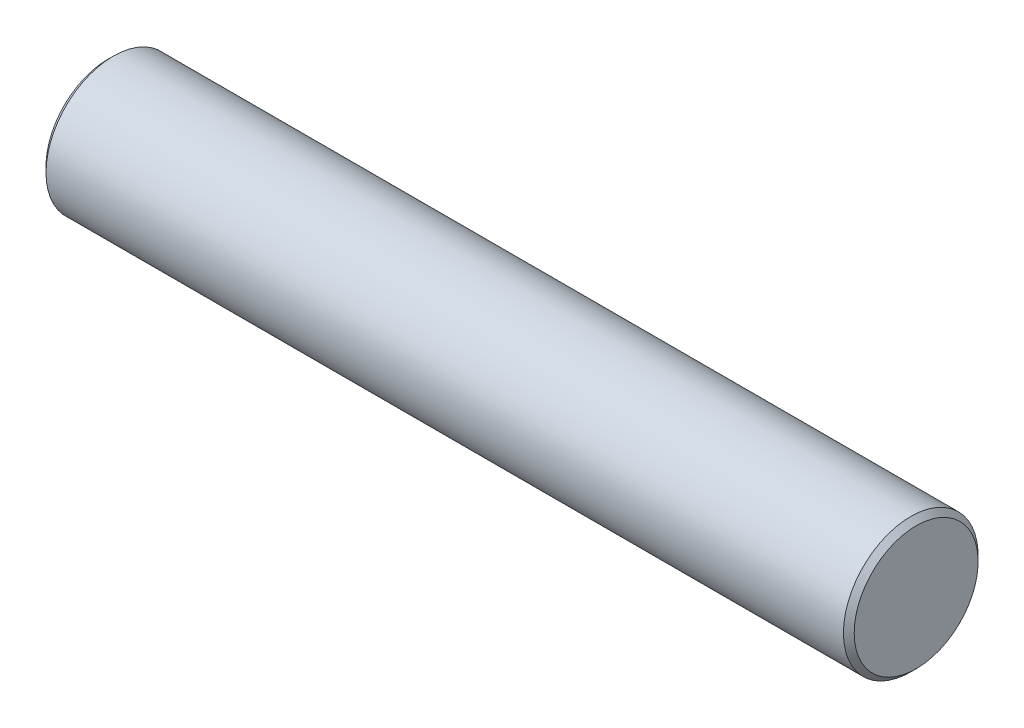
ISO-10303-21;
HEADER;
FILE_DESCRIPTION(('STEP AP214'),'2;1');
FILE_NAME('part.step','',(''),(''),'','','');
FILE_SCHEMA(('AUTOMOTIVE_DESIGN { 1 0 10303 214 1 1 1 1 }'));
ENDSEC;
DATA;
#1=APPLICATION_CONTEXT('core data for automotive mechanical design processes');
#2=APPLICATION_PROTOCOL_DEFINITION('international standard','automotive_design',2000,#1);
#3=PRODUCT_CONTEXT('',#1,'mechanical');
#4=PRODUCT('Part','Part','',(#3));
#5=PRODUCT_RELATED_PRODUCT_CATEGORY('part','',(#4));
#6=PRODUCT_DEFINITION_FORMATION('','',#4);
#7=PRODUCT_DEFINITION_CONTEXT('part definition',#1,'design');
#8=PRODUCT_DEFINITION('design','',#6,#7);
#9=PRODUCT_DEFINITION_SHAPE('','',#8);
#10=(LENGTH_UNIT() NAMED_UNIT(*) SI_UNIT(.MILLI.,.METRE.));
#11=(NAMED_UNIT(*) PLANE_ANGLE_UNIT() SI_UNIT($,.RADIAN.));
#12=(NAMED_UNIT(*) SI_UNIT($,.STERADIAN.) SOLID_ANGLE_UNIT());
#13=UNCERTAINTY_MEASURE_WITH_UNIT(LENGTH_MEASURE(1.E-05),#10,'distance_accuracy_value','');
#14=(GEOMETRIC_REPRESENTATION_CONTEXT(3) GLOBAL_UNCERTAINTY_ASSIGNED_CONTEXT((#13)) GLOBAL_UNIT_ASSIGNED_CONTEXT((#10,
#11,#12)) REPRESENTATION_CONTEXT('',''));
#15=CARTESIAN_POINT('',(0.,0.,0.));
#16=DIRECTION('',(0.,0.,1.));
#17=DIRECTION('',(1.,0.,0.));
#18=AXIS2_PLACEMENT_3D('',#15,#16,#17);
#19=CARTESIAN_POINT('',(0.,0.,0.));
#20=DIRECTION('',(1.,0.,0.));
#21=DIRECTION('',(0.,0.,-1.));
#22=AXIS2_PLACEMENT_3D('',#19,#20,#21);
#23=PLANE('',#22);
#24=CARTESIAN_POINT('',(0.,0.,0.));
#25=DIRECTION('',(1.,0.,0.));
#26=DIRECTION('',(0.,0.,-1.));
#27=AXIS2_PLACEMENT_3D('',#24,#25,#26);
#28=CIRCLE('',#27,2.3);
#29=CARTESIAN_POINT('',(0.,0.,-2.3));
#30=VERTEX_POINT('',#29);
#31=EDGE_CURVE('E58',#30,#30,#28,.F.);
#32=ORIENTED_EDGE('',*,*,#31,.T.);
#33=EDGE_LOOP('',(#32));
#34=FACE_BOUND('',#33,.T.);
#35=ADVANCED_FACE('F42',(#34),#23,.F.);
#36=CARTESIAN_POINT('',(0.,0.,0.));
#37=DIRECTION('',(-1.,0.,0.));
#38=DIRECTION('',(0.,0.,1.));
#39=AXIS2_PLACEMENT_3D('',#36,#37,#38);
#40=CYLINDRICAL_SURFACE('',#39,2.5);
#41=CARTESIAN_POINT('',(0.200000000000003,0.,0.));
#42=DIRECTION('',(1.,0.,0.));
#43=DIRECTION('',(0.,0.,-1.));
#44=AXIS2_PLACEMENT_3D('',#41,#42,#43);
#45=CIRCLE('',#44,2.5);
#46=CARTESIAN_POINT('',(0.200000000000003,0.,-2.5));
#47=VERTEX_POINT('',#46);
#48=EDGE_CURVE('E50',#47,#47,#45,.T.);
#49=ORIENTED_EDGE('',*,*,#48,.T.);
#50=EDGE_LOOP('',(#49));
#51=FACE_BOUND('',#50,.T.);
#52=CARTESIAN_POINT('',(29.8,0.,0.));
#53=DIRECTION('',(-1.,0.,0.));
#54=DIRECTION('',(0.,0.,1.));
#55=AXIS2_PLACEMENT_3D('',#52,#53,#54);
#56=CIRCLE('',#55,2.5);
#57=CARTESIAN_POINT('',(29.8,0.,2.5));
#58=VERTEX_POINT('',#57);
#59=EDGE_CURVE('E54',#58,#58,#56,.T.);
#60=ORIENTED_EDGE('',*,*,#59,.T.);
#61=EDGE_LOOP('',(#60));
#62=FACE_BOUND('',#61,.T.);
#63=ADVANCED_FACE('F74',(#51,#62),#40,.T.);
#64=CARTESIAN_POINT('',(30.,0.,0.));
#65=DIRECTION('',(-1.,0.,0.));
#66=DIRECTION('',(0.,0.,1.));
#67=AXIS2_PLACEMENT_3D('',#64,#65,#66);
#68=PLANE('',#67);
#69=CARTESIAN_POINT('',(30.,0.,0.));
#70=DIRECTION('',(-1.,0.,0.));
#71=DIRECTION('',(0.,0.,1.));
#72=AXIS2_PLACEMENT_3D('',#69,#70,#71);
#73=CIRCLE('',#72,2.30000000000001);
#74=CARTESIAN_POINT('',(30.,0.,2.30000000000001));
#75=VERTEX_POINT('',#74);
#76=EDGE_CURVE('E10',#75,#75,#73,.F.);
#77=ORIENTED_EDGE('',*,*,#76,.T.);
#78=EDGE_LOOP('',(#77));
#79=FACE_BOUND('',#78,.T.);
#80=ADVANCED_FACE('F67',(#79),#68,.F.);
#81=CARTESIAN_POINT('',(0.,0.,0.));
#82=DIRECTION('',(1.,0.,0.));
#83=DIRECTION('',(0.,0.,-1.));
#84=AXIS2_PLACEMENT_3D('',#81,#82,#83);
#85=CONICAL_SURFACE('',#84,2.3,0.785398163397441);
#86=ORIENTED_EDGE('',*,*,#48,.F.);
#87=EDGE_LOOP('',(#86));
#88=FACE_BOUND('',#87,.T.);
#89=ORIENTED_EDGE('',*,*,#31,.F.);
#90=EDGE_LOOP('',(#89));
#91=FACE_BOUND('',#90,.T.);
#92=ADVANCED_FACE('F65',(#88,#91),#85,.T.);
#93=CARTESIAN_POINT('',(29.8,0.,0.));
#94=DIRECTION('',(-1.,0.,0.));
#95=DIRECTION('',(0.,0.,1.));
#96=AXIS2_PLACEMENT_3D('',#93,#94,#95);
#97=CONICAL_SURFACE('',#96,2.5,0.785398163397443);
#98=ORIENTED_EDGE('',*,*,#76,.F.);
#99=EDGE_LOOP('',(#98));
#100=FACE_BOUND('',#99,.T.);
#101=ORIENTED_EDGE('',*,*,#59,.F.);
#102=EDGE_LOOP('',(#101));
#103=FACE_BOUND('',#102,.T.);
#104=ADVANCED_FACE('F45',(#100,#103),#97,.T.);
#105=CLOSED_SHELL('',(#35,#63,#80,#92,#104));
#106=MANIFOLD_SOLID_BREP('B2',#105);
#107=ADVANCED_BREP_SHAPE_REPRESENTATION('',(#18,#106),#14);
#108=SHAPE_DEFINITION_REPRESENTATION(#9,#107);
ENDSEC;
END-ISO-10303-21;
